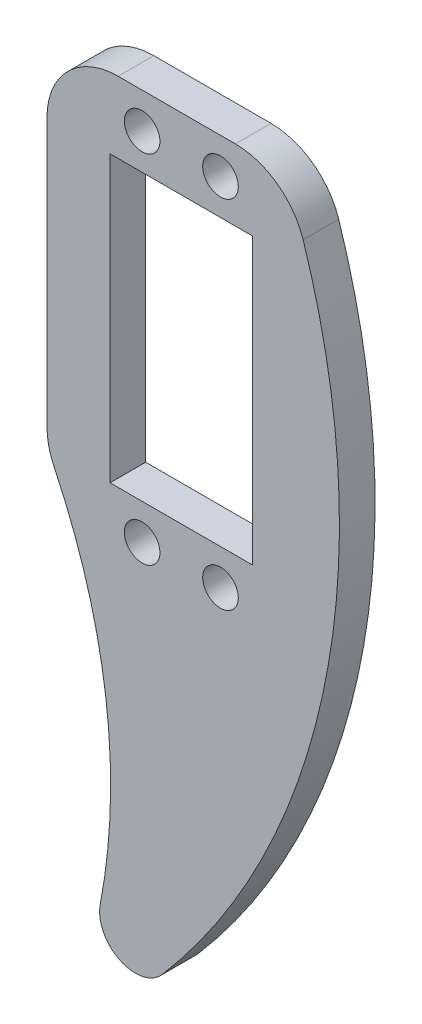
ISO-10303-21;
HEADER;
FILE_DESCRIPTION(('STEP AP214'),'2;1');
FILE_NAME('part.step','',(''),(''),'','','');
FILE_SCHEMA(('AUTOMOTIVE_DESIGN { 1 0 10303 214 1 1 1 1 }'));
ENDSEC;
DATA;
#1=APPLICATION_CONTEXT('core data for automotive mechanical design processes');
#2=APPLICATION_PROTOCOL_DEFINITION('international standard','automotive_design',2000,#1);
#3=PRODUCT_CONTEXT('',#1,'mechanical');
#4=PRODUCT('Part','Part','',(#3));
#5=PRODUCT_RELATED_PRODUCT_CATEGORY('part','',(#4));
#6=PRODUCT_DEFINITION_FORMATION('','',#4);
#7=PRODUCT_DEFINITION_CONTEXT('part definition',#1,'design');
#8=PRODUCT_DEFINITION('design','',#6,#7);
#9=PRODUCT_DEFINITION_SHAPE('','',#8);
#10=(LENGTH_UNIT() NAMED_UNIT(*) SI_UNIT(.MILLI.,.METRE.));
#11=(NAMED_UNIT(*) PLANE_ANGLE_UNIT() SI_UNIT($,.RADIAN.));
#12=(NAMED_UNIT(*) SI_UNIT($,.STERADIAN.) SOLID_ANGLE_UNIT());
#13=UNCERTAINTY_MEASURE_WITH_UNIT(LENGTH_MEASURE(1.E-05),#10,'distance_accuracy_value','');
#14=(GEOMETRIC_REPRESENTATION_CONTEXT(3) GLOBAL_UNCERTAINTY_ASSIGNED_CONTEXT((#13)) GLOBAL_UNIT_ASSIGNED_CONTEXT((#10,
#11,#12)) REPRESENTATION_CONTEXT('',''));
#15=CARTESIAN_POINT('',(0.,0.,0.));
#16=DIRECTION('',(0.,0.,1.));
#17=DIRECTION('',(1.,0.,0.));
#18=AXIS2_PLACEMENT_3D('',#15,#16,#17);
#19=CARTESIAN_POINT('',(-79.9221928965079,-76.7361523083227,5.));
#20=DIRECTION('',(0.,0.,1.));
#21=DIRECTION('',(1.,0.,0.));
#22=AXIS2_PLACEMENT_3D('',#19,#20,#21);
#23=PLANE('',#22);
#24=CARTESIAN_POINT('',(15.5,-45.,5.));
#25=DIRECTION('',(0.,0.,1.));
#26=DIRECTION('',(1.,0.,0.));
#27=AXIS2_PLACEMENT_3D('',#24,#25,#26);
#28=CIRCLE('',#27,2.5);
#29=CARTESIAN_POINT('',(18.,-45.,5.));
#30=VERTEX_POINT('',#29);
#31=EDGE_CURVE('E240',#30,#30,#28,.T.);
#32=ORIENTED_EDGE('',*,*,#31,.F.);
#33=EDGE_LOOP('',(#32));
#34=FACE_BOUND('',#33,.T.);
#35=CARTESIAN_POINT('',(4.5,-45.,5.));
#36=DIRECTION('',(0.,0.,1.));
#37=DIRECTION('',(1.,0.,0.));
#38=AXIS2_PLACEMENT_3D('',#35,#36,#37);
#39=CIRCLE('',#38,2.5);
#40=CARTESIAN_POINT('',(7.,-45.,5.));
#41=VERTEX_POINT('',#40);
#42=EDGE_CURVE('E230',#41,#41,#39,.T.);
#43=ORIENTED_EDGE('',*,*,#42,.F.);
#44=EDGE_LOOP('',(#43));
#45=FACE_BOUND('',#44,.T.);
#46=CARTESIAN_POINT('',(15.5,5.,5.));
#47=DIRECTION('',(0.,0.,1.));
#48=DIRECTION('',(1.,0.,0.));
#49=AXIS2_PLACEMENT_3D('',#46,#47,#48);
#50=CIRCLE('',#49,2.5);
#51=CARTESIAN_POINT('',(18.,5.,5.));
#52=VERTEX_POINT('',#51);
#53=EDGE_CURVE('E227',#52,#52,#50,.T.);
#54=ORIENTED_EDGE('',*,*,#53,.F.);
#55=EDGE_LOOP('',(#54));
#56=FACE_BOUND('',#55,.T.);
#57=CARTESIAN_POINT('',(4.5,5.,5.));
#58=DIRECTION('',(0.,0.,1.));
#59=DIRECTION('',(1.,0.,0.));
#60=AXIS2_PLACEMENT_3D('',#57,#58,#59);
#61=CIRCLE('',#60,2.5);
#62=CARTESIAN_POINT('',(7.,5.,5.));
#63=VERTEX_POINT('',#62);
#64=EDGE_CURVE('E224',#63,#63,#61,.T.);
#65=ORIENTED_EDGE('',*,*,#64,.F.);
#66=EDGE_LOOP('',(#65));
#67=FACE_BOUND('',#66,.T.);
#68=DIRECTION('',(0.,-1.,0.));
#69=VECTOR('',#68,1.);
#70=CARTESIAN_POINT('',(-8.85563878291863,10.,5.));
#71=LINE('',#70,#69);
#72=CARTESIAN_POINT('',(-8.85563878291863,0.,5.));
#73=VERTEX_POINT('',#72);
#74=CARTESIAN_POINT('',(-8.85563878291862,-37.6437770396275,5.));
#75=VERTEX_POINT('',#74);
#76=EDGE_CURVE('E182',#73,#75,#71,.T.);
#77=ORIENTED_EDGE('',*,*,#76,.T.);
#78=CARTESIAN_POINT('',(1.14436121708139,-37.6437770396275,5.));
#79=DIRECTION('',(0.,0.,1.));
#80=DIRECTION('',(1.,0.,0.));
#81=AXIS2_PLACEMENT_3D('',#78,#79,#80);
#82=CIRCLE('',#81,10.);
#83=CARTESIAN_POINT('',(-7.86303368442853,-41.9873742917047,5.));
#84=VERTEX_POINT('',#83);
#85=EDGE_CURVE('E44',#75,#84,#82,.T.);
#86=ORIENTED_EDGE('',*,*,#85,.T.);
#87=CARTESIAN_POINT('',(-79.9221928965079,-76.7361523083227,5.));
#88=DIRECTION('',(0.,0.,-1.));
#89=DIRECTION('',(1.,0.,0.));
#90=AXIS2_PLACEMENT_3D('',#87,#88,#89);
#91=CIRCLE('',#90,80.);
#92=CARTESIAN_POINT('',(-1.37328946589903,-91.9042032658083,5.));
#93=VERTEX_POINT('',#92);
#94=EDGE_CURVE('E172',#84,#93,#91,.T.);
#95=ORIENTED_EDGE('',*,*,#94,.T.);
#96=CARTESIAN_POINT('',(3.53601699851402,-92.8522064506512,5.));
#97=DIRECTION('',(0.,0.,1.));
#98=DIRECTION('',(1.,0.,0.));
#99=AXIS2_PLACEMENT_3D('',#96,#97,#98);
#100=CIRCLE('',#99,5.);
#101=CARTESIAN_POINT('',(7.33041373146968,-96.1083626866042,5.));
#102=VERTEX_POINT('',#101);
#103=EDGE_CURVE('E174',#93,#102,#100,.T.);
#104=ORIENTED_EDGE('',*,*,#103,.T.);
#105=CARTESIAN_POINT('',(-70.9451372093537,-28.9363084032652,5.));
#106=DIRECTION('',(0.,0.,1.));
#107=DIRECTION('',(-1.,0.,0.));
#108=AXIS2_PLACEMENT_3D('',#105,#106,#107);
#109=CIRCLE('',#108,103.146239639326);
#110=CARTESIAN_POINT('',(27.0977219359634,3.10654606297691,5.));
#111=VERTEX_POINT('',#110);
#112=EDGE_CURVE('E177',#102,#111,#109,.T.);
#113=ORIENTED_EDGE('',*,*,#112,.T.);
#114=CARTESIAN_POINT('',(17.5924932928112,0.,5.));
#115=DIRECTION('',(0.,0.,1.));
#116=DIRECTION('',(1.,0.,0.));
#117=AXIS2_PLACEMENT_3D('',#114,#115,#116);
#118=CIRCLE('',#117,10.);
#119=CARTESIAN_POINT('',(17.5924932928112,10.,5.));
#120=VERTEX_POINT('',#119);
#121=EDGE_CURVE('E206',#111,#120,#118,.T.);
#122=ORIENTED_EDGE('',*,*,#121,.T.);
#123=DIRECTION('',(-1.,0.,0.));
#124=VECTOR('',#123,1.);
#125=CARTESIAN_POINT('',(-8.85563878291863,10.,5.));
#126=LINE('',#125,#124);
#127=CARTESIAN_POINT('',(1.14436121708137,10.,5.));
#128=VERTEX_POINT('',#127);
#129=EDGE_CURVE('E180',#120,#128,#126,.T.);
#130=ORIENTED_EDGE('',*,*,#129,.T.);
#131=CARTESIAN_POINT('',(1.14436121708137,0.,5.));
#132=DIRECTION('',(0.,0.,1.));
#133=DIRECTION('',(1.,0.,0.));
#134=AXIS2_PLACEMENT_3D('',#131,#132,#133);
#135=CIRCLE('',#134,10.);
#136=EDGE_CURVE('E219',#128,#73,#135,.T.);
#137=ORIENTED_EDGE('',*,*,#136,.T.);
#138=EDGE_LOOP('',(#77,#86,#95,#104,#113,#122,#130,#137));
#139=FACE_BOUND('',#138,.T.);
#140=DIRECTION('',(1.,0.,0.));
#141=VECTOR('',#140,1.);
#142=CARTESIAN_POINT('',(0.,-40.,5.));
#143=LINE('',#142,#141);
#144=CARTESIAN_POINT('',(0.,-40.,5.));
#145=VERTEX_POINT('',#144);
#146=CARTESIAN_POINT('',(20.,-40.,5.));
#147=VERTEX_POINT('',#146);
#148=EDGE_CURVE('E139',#145,#147,#143,.T.);
#149=ORIENTED_EDGE('',*,*,#148,.F.);
#150=DIRECTION('',(0.,-1.,0.));
#151=VECTOR('',#150,1.);
#152=CARTESIAN_POINT('',(0.,0.,5.));
#153=LINE('',#152,#151);
#154=CARTESIAN_POINT('',(0.,0.,5.));
#155=VERTEX_POINT('',#154);
#156=EDGE_CURVE('E129',#155,#145,#153,.T.);
#157=ORIENTED_EDGE('',*,*,#156,.F.);
#158=DIRECTION('',(-1.,0.,0.));
#159=VECTOR('',#158,1.);
#160=CARTESIAN_POINT('',(0.,0.,5.));
#161=LINE('',#160,#159);
#162=CARTESIAN_POINT('',(20.,0.,5.));
#163=VERTEX_POINT('',#162);
#164=EDGE_CURVE('E154',#163,#155,#161,.T.);
#165=ORIENTED_EDGE('',*,*,#164,.F.);
#166=DIRECTION('',(0.,1.,0.));
#167=VECTOR('',#166,1.);
#168=CARTESIAN_POINT('',(20.,0.,5.));
#169=LINE('',#168,#167);
#170=EDGE_CURVE('E152',#147,#163,#169,.T.);
#171=ORIENTED_EDGE('',*,*,#170,.F.);
#172=EDGE_LOOP('',(#149,#157,#165,#171));
#173=FACE_BOUND('',#172,.T.);
#174=ADVANCED_FACE('F35',(#34,#45,#56,#67,#139,#173),#23,.T.);
#175=CARTESIAN_POINT('',(-79.9221928965079,-76.7361523083227,0.));
#176=DIRECTION('',(0.,0.,1.));
#177=DIRECTION('',(1.,0.,0.));
#178=AXIS2_PLACEMENT_3D('',#175,#176,#177);
#179=PLANE('',#178);
#180=CARTESIAN_POINT('',(15.5,-45.,0.));
#181=DIRECTION('',(0.,0.,1.));
#182=DIRECTION('',(1.,0.,0.));
#183=AXIS2_PLACEMENT_3D('',#180,#181,#182);
#184=CIRCLE('',#183,2.5);
#185=CARTESIAN_POINT('',(18.,-45.,0.));
#186=VERTEX_POINT('',#185);
#187=EDGE_CURVE('E39',#186,#186,#184,.T.);
#188=ORIENTED_EDGE('',*,*,#187,.T.);
#189=EDGE_LOOP('',(#188));
#190=FACE_BOUND('',#189,.T.);
#191=CARTESIAN_POINT('',(4.5,-45.,0.));
#192=DIRECTION('',(0.,0.,1.));
#193=DIRECTION('',(1.,0.,0.));
#194=AXIS2_PLACEMENT_3D('',#191,#192,#193);
#195=CIRCLE('',#194,2.5);
#196=CARTESIAN_POINT('',(7.,-45.,0.));
#197=VERTEX_POINT('',#196);
#198=EDGE_CURVE('E228',#197,#197,#195,.T.);
#199=ORIENTED_EDGE('',*,*,#198,.T.);
#200=EDGE_LOOP('',(#199));
#201=FACE_BOUND('',#200,.T.);
#202=CARTESIAN_POINT('',(15.5,5.,0.));
#203=DIRECTION('',(0.,0.,1.));
#204=DIRECTION('',(1.,0.,0.));
#205=AXIS2_PLACEMENT_3D('',#202,#203,#204);
#206=CIRCLE('',#205,2.5);
#207=CARTESIAN_POINT('',(18.,5.,0.));
#208=VERTEX_POINT('',#207);
#209=EDGE_CURVE('E225',#208,#208,#206,.T.);
#210=ORIENTED_EDGE('',*,*,#209,.T.);
#211=EDGE_LOOP('',(#210));
#212=FACE_BOUND('',#211,.T.);
#213=CARTESIAN_POINT('',(4.5,5.,0.));
#214=DIRECTION('',(0.,0.,1.));
#215=DIRECTION('',(1.,0.,0.));
#216=AXIS2_PLACEMENT_3D('',#213,#214,#215);
#217=CIRCLE('',#216,2.5);
#218=CARTESIAN_POINT('',(7.,5.,0.));
#219=VERTEX_POINT('',#218);
#220=EDGE_CURVE('E161',#219,#219,#217,.T.);
#221=ORIENTED_EDGE('',*,*,#220,.T.);
#222=EDGE_LOOP('',(#221));
#223=FACE_BOUND('',#222,.T.);
#224=CARTESIAN_POINT('',(-79.9221928965079,-76.7361523083227,0.));
#225=DIRECTION('',(0.,0.,-1.));
#226=DIRECTION('',(1.,0.,0.));
#227=AXIS2_PLACEMENT_3D('',#224,#225,#226);
#228=CIRCLE('',#227,80.);
#229=CARTESIAN_POINT('',(-7.86303368442853,-41.9873742917047,0.));
#230=VERTEX_POINT('',#229);
#231=CARTESIAN_POINT('',(-1.37328946589903,-91.9042032658083,0.));
#232=VERTEX_POINT('',#231);
#233=EDGE_CURVE('E147',#230,#232,#228,.T.);
#234=ORIENTED_EDGE('',*,*,#233,.F.);
#235=CARTESIAN_POINT('',(1.14436121708139,-37.6437770396275,0.));
#236=DIRECTION('',(0.,0.,1.));
#237=DIRECTION('',(1.,0.,0.));
#238=AXIS2_PLACEMENT_3D('',#235,#236,#237);
#239=CIRCLE('',#238,10.);
#240=CARTESIAN_POINT('',(-8.85563878291862,-37.6437770396275,0.));
#241=VERTEX_POINT('',#240);
#242=EDGE_CURVE('E213',#230,#241,#239,.F.);
#243=ORIENTED_EDGE('',*,*,#242,.T.);
#244=DIRECTION('',(0.,-1.,0.));
#245=VECTOR('',#244,1.);
#246=CARTESIAN_POINT('',(-8.85563878291863,10.,0.));
#247=LINE('',#246,#245);
#248=CARTESIAN_POINT('',(-8.85563878291863,0.,0.));
#249=VERTEX_POINT('',#248);
#250=EDGE_CURVE('E175',#249,#241,#247,.T.);
#251=ORIENTED_EDGE('',*,*,#250,.F.);
#252=CARTESIAN_POINT('',(1.14436121708137,0.,0.));
#253=DIRECTION('',(0.,0.,1.));
#254=DIRECTION('',(1.,0.,0.));
#255=AXIS2_PLACEMENT_3D('',#252,#253,#254);
#256=CIRCLE('',#255,10.);
#257=CARTESIAN_POINT('',(1.14436121708137,10.,0.));
#258=VERTEX_POINT('',#257);
#259=EDGE_CURVE('E211',#249,#258,#256,.F.);
#260=ORIENTED_EDGE('',*,*,#259,.T.);
#261=DIRECTION('',(-1.,0.,0.));
#262=VECTOR('',#261,1.);
#263=CARTESIAN_POINT('',(-8.85563878291863,10.,0.));
#264=LINE('',#263,#262);
#265=CARTESIAN_POINT('',(17.5924932928112,10.,0.));
#266=VERTEX_POINT('',#265);
#267=EDGE_CURVE('E191',#266,#258,#264,.T.);
#268=ORIENTED_EDGE('',*,*,#267,.F.);
#269=CARTESIAN_POINT('',(17.5924932928112,0.,0.));
#270=DIRECTION('',(0.,0.,1.));
#271=DIRECTION('',(1.,0.,0.));
#272=AXIS2_PLACEMENT_3D('',#269,#270,#271);
#273=CIRCLE('',#272,10.);
#274=CARTESIAN_POINT('',(27.0977219359634,3.10654606297691,0.));
#275=VERTEX_POINT('',#274);
#276=EDGE_CURVE('E202',#266,#275,#273,.F.);
#277=ORIENTED_EDGE('',*,*,#276,.T.);
#278=CARTESIAN_POINT('',(-70.9451372093537,-28.9363084032652,0.));
#279=DIRECTION('',(0.,0.,1.));
#280=DIRECTION('',(-1.,0.,0.));
#281=AXIS2_PLACEMENT_3D('',#278,#279,#280);
#282=CIRCLE('',#281,103.146239639326);
#283=CARTESIAN_POINT('',(7.33041373146968,-96.1083626866042,0.));
#284=VERTEX_POINT('',#283);
#285=EDGE_CURVE('E188',#284,#275,#282,.T.);
#286=ORIENTED_EDGE('',*,*,#285,.F.);
#287=CARTESIAN_POINT('',(3.53601699851402,-92.8522064506512,0.));
#288=DIRECTION('',(0.,0.,1.));
#289=DIRECTION('',(1.,0.,0.));
#290=AXIS2_PLACEMENT_3D('',#287,#288,#289);
#291=CIRCLE('',#290,5.);
#292=EDGE_CURVE('E186',#232,#284,#291,.T.);
#293=ORIENTED_EDGE('',*,*,#292,.F.);
#294=EDGE_LOOP('',(#234,#243,#251,#260,#268,#277,#286,#293));
#295=FACE_BOUND('',#294,.T.);
#296=DIRECTION('',(0.,-1.,0.));
#297=VECTOR('',#296,1.);
#298=CARTESIAN_POINT('',(0.,0.,0.));
#299=LINE('',#298,#297);
#300=CARTESIAN_POINT('',(0.,0.,0.));
#301=VERTEX_POINT('',#300);
#302=CARTESIAN_POINT('',(0.,-40.,0.));
#303=VERTEX_POINT('',#302);
#304=EDGE_CURVE('E159',#301,#303,#299,.T.);
#305=ORIENTED_EDGE('',*,*,#304,.T.);
#306=DIRECTION('',(1.,0.,0.));
#307=VECTOR('',#306,1.);
#308=CARTESIAN_POINT('',(0.,-40.,0.));
#309=LINE('',#308,#307);
#310=CARTESIAN_POINT('',(20.,-40.,0.));
#311=VERTEX_POINT('',#310);
#312=EDGE_CURVE('E146',#303,#311,#309,.T.);
#313=ORIENTED_EDGE('',*,*,#312,.T.);
#314=DIRECTION('',(0.,1.,0.));
#315=VECTOR('',#314,1.);
#316=CARTESIAN_POINT('',(20.,0.,0.));
#317=LINE('',#316,#315);
#318=CARTESIAN_POINT('',(20.,0.,0.));
#319=VERTEX_POINT('',#318);
#320=EDGE_CURVE('E163',#311,#319,#317,.T.);
#321=ORIENTED_EDGE('',*,*,#320,.T.);
#322=DIRECTION('',(-1.,0.,0.));
#323=VECTOR('',#322,1.);
#324=CARTESIAN_POINT('',(0.,0.,0.));
#325=LINE('',#324,#323);
#326=EDGE_CURVE('E140',#319,#301,#325,.T.);
#327=ORIENTED_EDGE('',*,*,#326,.T.);
#328=EDGE_LOOP('',(#305,#313,#321,#327));
#329=FACE_BOUND('',#328,.T.);
#330=ADVANCED_FACE('F250',(#190,#201,#212,#223,#295,#329),#179,.F.);
#331=CARTESIAN_POINT('',(-79.9221928965079,-76.7361523083227,5.));
#332=DIRECTION('',(0.,0.,-1.));
#333=DIRECTION('',(-1.,0.,0.));
#334=AXIS2_PLACEMENT_3D('',#331,#332,#333);
#335=CYLINDRICAL_SURFACE('',#334,80.);
#336=ORIENTED_EDGE('',*,*,#94,.F.);
#337=DIRECTION('',(0.,0.,-1.));
#338=VECTOR('',#337,1.);
#339=CARTESIAN_POINT('',(-7.86303368442853,-41.9873742917047,5.));
#340=LINE('',#339,#338);
#341=EDGE_CURVE('E208',#84,#230,#340,.T.);
#342=ORIENTED_EDGE('',*,*,#341,.T.);
#343=ORIENTED_EDGE('',*,*,#233,.T.);
#344=DIRECTION('',(0.,0.,-1.));
#345=VECTOR('',#344,1.);
#346=CARTESIAN_POINT('',(-1.37328946589903,-91.9042032658083,5.));
#347=LINE('',#346,#345);
#348=EDGE_CURVE('E196',#93,#232,#347,.T.);
#349=ORIENTED_EDGE('',*,*,#348,.F.);
#350=EDGE_LOOP('',(#336,#342,#343,#349));
#351=FACE_BOUND('',#350,.T.);
#352=ADVANCED_FACE('F262',(#351),#335,.F.);
#353=CARTESIAN_POINT('',(3.53601699851402,-92.8522064506512,5.));
#354=DIRECTION('',(0.,0.,-1.));
#355=DIRECTION('',(-1.,0.,0.));
#356=AXIS2_PLACEMENT_3D('',#353,#354,#355);
#357=CYLINDRICAL_SURFACE('',#356,5.);
#358=ORIENTED_EDGE('',*,*,#292,.T.);
#359=DIRECTION('',(0.,0.,-1.));
#360=VECTOR('',#359,1.);
#361=CARTESIAN_POINT('',(7.33041373146968,-96.1083626866042,5.));
#362=LINE('',#361,#360);
#363=EDGE_CURVE('E184',#102,#284,#362,.T.);
#364=ORIENTED_EDGE('',*,*,#363,.F.);
#365=ORIENTED_EDGE('',*,*,#103,.F.);
#366=ORIENTED_EDGE('',*,*,#348,.T.);
#367=EDGE_LOOP('',(#358,#364,#365,#366));
#368=FACE_BOUND('',#367,.T.);
#369=ADVANCED_FACE('F272',(#368),#357,.T.);
#370=CARTESIAN_POINT('',(-70.9451372093537,-28.9363084032652,5.));
#371=DIRECTION('',(0.,0.,-1.));
#372=DIRECTION('',(-1.,0.,0.));
#373=AXIS2_PLACEMENT_3D('',#370,#371,#372);
#374=CYLINDRICAL_SURFACE('',#373,103.146239639326);
#375=ORIENTED_EDGE('',*,*,#285,.T.);
#376=DIRECTION('',(0.,0.,-1.));
#377=VECTOR('',#376,1.);
#378=CARTESIAN_POINT('',(27.0977219359634,3.10654606297691,5.));
#379=LINE('',#378,#377);
#380=EDGE_CURVE('E204',#275,#111,#379,.F.);
#381=ORIENTED_EDGE('',*,*,#380,.T.);
#382=ORIENTED_EDGE('',*,*,#112,.F.);
#383=ORIENTED_EDGE('',*,*,#363,.T.);
#384=EDGE_LOOP('',(#375,#381,#382,#383));
#385=FACE_BOUND('',#384,.T.);
#386=ADVANCED_FACE('F291',(#385),#374,.T.);
#387=CARTESIAN_POINT('',(-8.85563878291863,10.,5.));
#388=DIRECTION('',(0.,-1.,0.));
#389=DIRECTION('',(0.,0.,-1.));
#390=AXIS2_PLACEMENT_3D('',#387,#388,#389);
#391=PLANE('',#390);
#392=ORIENTED_EDGE('',*,*,#267,.T.);
#393=DIRECTION('',(0.,0.,-1.));
#394=VECTOR('',#393,1.);
#395=CARTESIAN_POINT('',(1.14436121708137,10.,5.));
#396=LINE('',#395,#394);
#397=EDGE_CURVE('E11',#258,#128,#396,.F.);
#398=ORIENTED_EDGE('',*,*,#397,.T.);
#399=ORIENTED_EDGE('',*,*,#129,.F.);
#400=DIRECTION('',(0.,0.,-1.));
#401=VECTOR('',#400,1.);
#402=CARTESIAN_POINT('',(17.5924932928112,10.,5.));
#403=LINE('',#402,#401);
#404=EDGE_CURVE('E199',#120,#266,#403,.T.);
#405=ORIENTED_EDGE('',*,*,#404,.T.);
#406=EDGE_LOOP('',(#392,#398,#399,#405));
#407=FACE_BOUND('',#406,.T.);
#408=ADVANCED_FACE('F281',(#407),#391,.F.);
#409=CARTESIAN_POINT('',(-8.85563878291863,10.,5.));
#410=DIRECTION('',(1.,0.,0.));
#411=DIRECTION('',(0.,1.,0.));
#412=AXIS2_PLACEMENT_3D('',#409,#410,#411);
#413=PLANE('',#412);
#414=ORIENTED_EDGE('',*,*,#250,.T.);
#415=DIRECTION('',(0.,0.,-1.));
#416=VECTOR('',#415,1.);
#417=CARTESIAN_POINT('',(-8.85563878291862,-37.6437770396275,5.));
#418=LINE('',#417,#416);
#419=EDGE_CURVE('E58',#241,#75,#418,.F.);
#420=ORIENTED_EDGE('',*,*,#419,.T.);
#421=ORIENTED_EDGE('',*,*,#76,.F.);
#422=DIRECTION('',(0.,0.,-1.));
#423=VECTOR('',#422,1.);
#424=CARTESIAN_POINT('',(-8.85563878291863,0.,5.));
#425=LINE('',#424,#423);
#426=EDGE_CURVE('E215',#73,#249,#425,.T.);
#427=ORIENTED_EDGE('',*,*,#426,.T.);
#428=EDGE_LOOP('',(#414,#420,#421,#427));
#429=FACE_BOUND('',#428,.T.);
#430=ADVANCED_FACE('F283',(#429),#413,.F.);
#431=CARTESIAN_POINT('',(0.,0.,5.));
#432=DIRECTION('',(1.,0.,0.));
#433=DIRECTION('',(0.,1.,0.));
#434=AXIS2_PLACEMENT_3D('',#431,#432,#433);
#435=PLANE('',#434);
#436=ORIENTED_EDGE('',*,*,#304,.F.);
#437=DIRECTION('',(0.,0.,-1.));
#438=VECTOR('',#437,1.);
#439=CARTESIAN_POINT('',(0.,0.,5.));
#440=LINE('',#439,#438);
#441=EDGE_CURVE('E135',#155,#301,#440,.T.);
#442=ORIENTED_EDGE('',*,*,#441,.F.);
#443=ORIENTED_EDGE('',*,*,#156,.T.);
#444=DIRECTION('',(0.,0.,-1.));
#445=VECTOR('',#444,1.);
#446=CARTESIAN_POINT('',(0.,-40.,5.));
#447=LINE('',#446,#445);
#448=EDGE_CURVE('E132',#145,#303,#447,.T.);
#449=ORIENTED_EDGE('',*,*,#448,.T.);
#450=EDGE_LOOP('',(#436,#442,#443,#449));
#451=FACE_BOUND('',#450,.T.);
#452=ADVANCED_FACE('F131',(#451),#435,.T.);
#453=CARTESIAN_POINT('',(0.,-40.,5.));
#454=DIRECTION('',(0.,1.,0.));
#455=DIRECTION('',(0.,0.,1.));
#456=AXIS2_PLACEMENT_3D('',#453,#454,#455);
#457=PLANE('',#456);
#458=ORIENTED_EDGE('',*,*,#312,.F.);
#459=ORIENTED_EDGE('',*,*,#448,.F.);
#460=ORIENTED_EDGE('',*,*,#148,.T.);
#461=DIRECTION('',(0.,0.,-1.));
#462=VECTOR('',#461,1.);
#463=CARTESIAN_POINT('',(20.,-40.,5.));
#464=LINE('',#463,#462);
#465=EDGE_CURVE('E148',#147,#311,#464,.T.);
#466=ORIENTED_EDGE('',*,*,#465,.T.);
#467=EDGE_LOOP('',(#458,#459,#460,#466));
#468=FACE_BOUND('',#467,.T.);
#469=ADVANCED_FACE('F143',(#468),#457,.T.);
#470=CARTESIAN_POINT('',(20.,0.,5.));
#471=DIRECTION('',(-1.,0.,0.));
#472=DIRECTION('',(0.,-1.,0.));
#473=AXIS2_PLACEMENT_3D('',#470,#471,#472);
#474=PLANE('',#473);
#475=ORIENTED_EDGE('',*,*,#320,.F.);
#476=ORIENTED_EDGE('',*,*,#465,.F.);
#477=ORIENTED_EDGE('',*,*,#170,.T.);
#478=DIRECTION('',(0.,0.,-1.));
#479=VECTOR('',#478,1.);
#480=CARTESIAN_POINT('',(20.,0.,5.));
#481=LINE('',#480,#479);
#482=EDGE_CURVE('E169',#163,#319,#481,.T.);
#483=ORIENTED_EDGE('',*,*,#482,.T.);
#484=EDGE_LOOP('',(#475,#476,#477,#483));
#485=FACE_BOUND('',#484,.T.);
#486=ADVANCED_FACE('F322',(#485),#474,.T.);
#487=CARTESIAN_POINT('',(0.,0.,5.));
#488=DIRECTION('',(0.,-1.,0.));
#489=DIRECTION('',(0.,0.,-1.));
#490=AXIS2_PLACEMENT_3D('',#487,#488,#489);
#491=PLANE('',#490);
#492=ORIENTED_EDGE('',*,*,#326,.F.);
#493=ORIENTED_EDGE('',*,*,#482,.F.);
#494=ORIENTED_EDGE('',*,*,#164,.T.);
#495=ORIENTED_EDGE('',*,*,#441,.T.);
#496=EDGE_LOOP('',(#492,#493,#494,#495));
#497=FACE_BOUND('',#496,.T.);
#498=ADVANCED_FACE('F302',(#497),#491,.T.);
#499=CARTESIAN_POINT('',(17.5924932928112,0.,5.));
#500=DIRECTION('',(0.,0.,-1.));
#501=DIRECTION('',(-1.,0.,0.));
#502=AXIS2_PLACEMENT_3D('',#499,#500,#501);
#503=CYLINDRICAL_SURFACE('',#502,10.);
#504=ORIENTED_EDGE('',*,*,#121,.F.);
#505=ORIENTED_EDGE('',*,*,#380,.F.);
#506=ORIENTED_EDGE('',*,*,#276,.F.);
#507=ORIENTED_EDGE('',*,*,#404,.F.);
#508=EDGE_LOOP('',(#504,#505,#506,#507));
#509=FACE_BOUND('',#508,.T.);
#510=ADVANCED_FACE('F279',(#509),#503,.T.);
#511=CARTESIAN_POINT('',(1.14436121708139,-37.6437770396275,5.));
#512=DIRECTION('',(0.,0.,-1.));
#513=DIRECTION('',(-1.,0.,0.));
#514=AXIS2_PLACEMENT_3D('',#511,#512,#513);
#515=CYLINDRICAL_SURFACE('',#514,10.);
#516=ORIENTED_EDGE('',*,*,#85,.F.);
#517=ORIENTED_EDGE('',*,*,#419,.F.);
#518=ORIENTED_EDGE('',*,*,#242,.F.);
#519=ORIENTED_EDGE('',*,*,#341,.F.);
#520=EDGE_LOOP('',(#516,#517,#518,#519));
#521=FACE_BOUND('',#520,.T.);
#522=ADVANCED_FACE('F259',(#521),#515,.T.);
#523=CARTESIAN_POINT('',(1.14436121708137,0.,5.));
#524=DIRECTION('',(0.,0.,-1.));
#525=DIRECTION('',(-1.,0.,0.));
#526=AXIS2_PLACEMENT_3D('',#523,#524,#525);
#527=CYLINDRICAL_SURFACE('',#526,10.);
#528=ORIENTED_EDGE('',*,*,#136,.F.);
#529=ORIENTED_EDGE('',*,*,#397,.F.);
#530=ORIENTED_EDGE('',*,*,#259,.F.);
#531=ORIENTED_EDGE('',*,*,#426,.F.);
#532=EDGE_LOOP('',(#528,#529,#530,#531));
#533=FACE_BOUND('',#532,.T.);
#534=ADVANCED_FACE('F37',(#533),#527,.T.);
#535=CARTESIAN_POINT('',(4.5,5.,-5.));
#536=DIRECTION('',(0.,0.,1.));
#537=DIRECTION('',(1.,0.,0.));
#538=AXIS2_PLACEMENT_3D('',#535,#536,#537);
#539=CYLINDRICAL_SURFACE('',#538,2.5);
#540=ORIENTED_EDGE('',*,*,#64,.T.);
#541=EDGE_LOOP('',(#540));
#542=FACE_BOUND('',#541,.T.);
#543=ORIENTED_EDGE('',*,*,#220,.F.);
#544=EDGE_LOOP('',(#543));
#545=FACE_BOUND('',#544,.T.);
#546=ADVANCED_FACE('F245',(#542,#545),#539,.F.);
#547=CARTESIAN_POINT('',(15.5,5.,-5.));
#548=DIRECTION('',(0.,0.,1.));
#549=DIRECTION('',(1.,0.,0.));
#550=AXIS2_PLACEMENT_3D('',#547,#548,#549);
#551=CYLINDRICAL_SURFACE('',#550,2.5);
#552=ORIENTED_EDGE('',*,*,#53,.T.);
#553=EDGE_LOOP('',(#552));
#554=FACE_BOUND('',#553,.T.);
#555=ORIENTED_EDGE('',*,*,#209,.F.);
#556=EDGE_LOOP('',(#555));
#557=FACE_BOUND('',#556,.T.);
#558=ADVANCED_FACE('F310',(#554,#557),#551,.F.);
#559=CARTESIAN_POINT('',(4.5,-45.,-5.));
#560=DIRECTION('',(0.,0.,1.));
#561=DIRECTION('',(1.,0.,0.));
#562=AXIS2_PLACEMENT_3D('',#559,#560,#561);
#563=CYLINDRICAL_SURFACE('',#562,2.5);
#564=ORIENTED_EDGE('',*,*,#42,.T.);
#565=EDGE_LOOP('',(#564));
#566=FACE_BOUND('',#565,.T.);
#567=ORIENTED_EDGE('',*,*,#198,.F.);
#568=EDGE_LOOP('',(#567));
#569=FACE_BOUND('',#568,.T.);
#570=ADVANCED_FACE('F315',(#566,#569),#563,.F.);
#571=CARTESIAN_POINT('',(15.5,-45.,-5.));
#572=DIRECTION('',(0.,0.,1.));
#573=DIRECTION('',(1.,0.,0.));
#574=AXIS2_PLACEMENT_3D('',#571,#572,#573);
#575=CYLINDRICAL_SURFACE('',#574,2.5);
#576=ORIENTED_EDGE('',*,*,#31,.T.);
#577=EDGE_LOOP('',(#576));
#578=FACE_BOUND('',#577,.T.);
#579=ORIENTED_EDGE('',*,*,#187,.F.);
#580=EDGE_LOOP('',(#579));
#581=FACE_BOUND('',#580,.T.);
#582=ADVANCED_FACE('F406',(#578,#581),#575,.F.);
#583=CLOSED_SHELL('',(#174,#330,#352,#369,#386,#408,#430,#452,#469,#486,#498,#510,#522,#534,
#546,#558,#570,#582));
#584=MANIFOLD_SOLID_BREP('B2',#583);
#585=ADVANCED_BREP_SHAPE_REPRESENTATION('',(#18,#584),#14);
#586=SHAPE_DEFINITION_REPRESENTATION(#9,#585);
ENDSEC;
END-ISO-10303-21;
